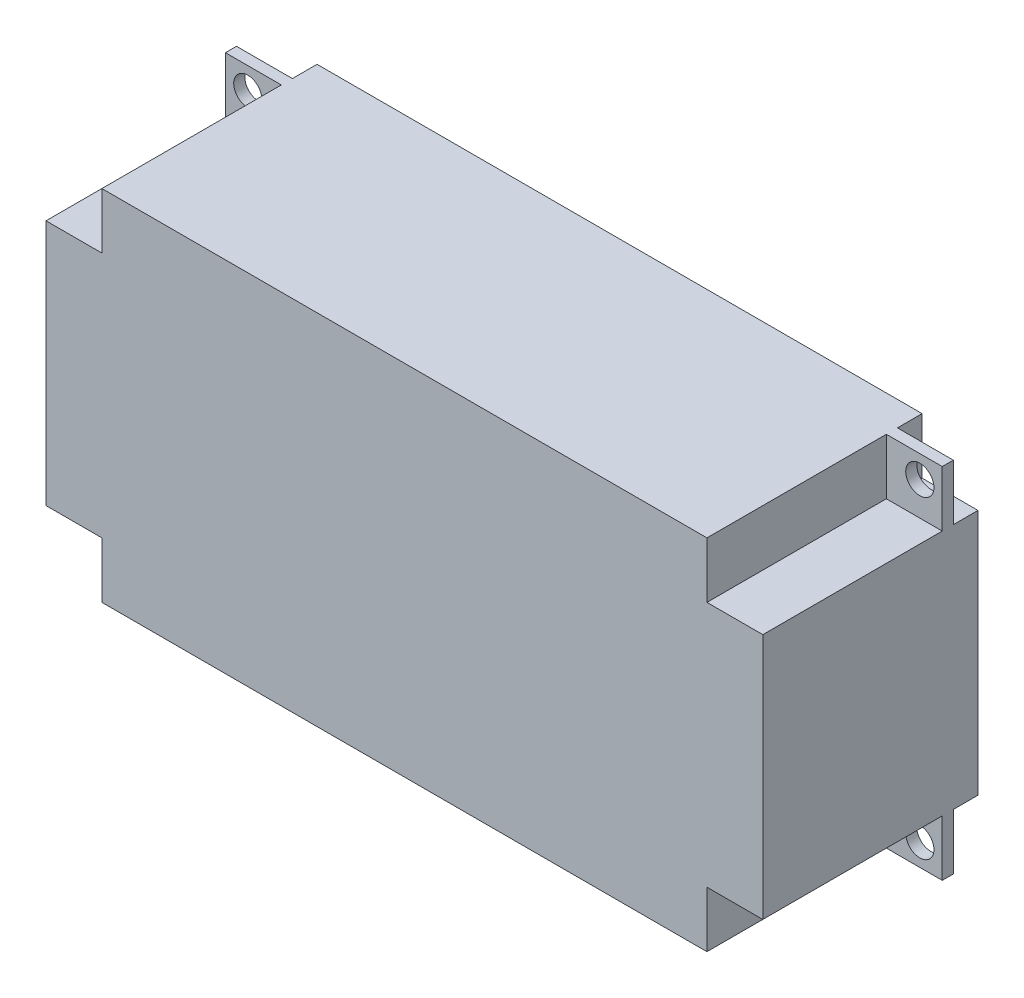
ISO-10303-21;
HEADER;
FILE_DESCRIPTION(('STEP AP214'),'2;1');
FILE_NAME('part.step','',(''),(''),'','','');
FILE_SCHEMA(('AUTOMOTIVE_DESIGN { 1 0 10303 214 1 1 1 1 }'));
ENDSEC;
DATA;
#1=APPLICATION_CONTEXT('core data for automotive mechanical design processes');
#2=APPLICATION_PROTOCOL_DEFINITION('international standard','automotive_design',2000,#1);
#3=PRODUCT_CONTEXT('',#1,'mechanical');
#4=PRODUCT('Part','Part','',(#3));
#5=PRODUCT_RELATED_PRODUCT_CATEGORY('part','',(#4));
#6=PRODUCT_DEFINITION_FORMATION('','',#4);
#7=PRODUCT_DEFINITION_CONTEXT('part definition',#1,'design');
#8=PRODUCT_DEFINITION('design','',#6,#7);
#9=PRODUCT_DEFINITION_SHAPE('','',#8);
#10=(LENGTH_UNIT() NAMED_UNIT(*) SI_UNIT(.MILLI.,.METRE.));
#11=(NAMED_UNIT(*) PLANE_ANGLE_UNIT() SI_UNIT($,.RADIAN.));
#12=(NAMED_UNIT(*) SI_UNIT($,.STERADIAN.) SOLID_ANGLE_UNIT());
#13=UNCERTAINTY_MEASURE_WITH_UNIT(LENGTH_MEASURE(1.E-05),#10,'distance_accuracy_value','');
#14=(GEOMETRIC_REPRESENTATION_CONTEXT(3) GLOBAL_UNCERTAINTY_ASSIGNED_CONTEXT((#13)) GLOBAL_UNIT_ASSIGNED_CONTEXT((#10,
#11,#12)) REPRESENTATION_CONTEXT('',''));
#15=CARTESIAN_POINT('',(0.,0.,0.));
#16=DIRECTION('',(0.,0.,1.));
#17=DIRECTION('',(1.,0.,0.));
#18=AXIS2_PLACEMENT_3D('',#15,#16,#17);
#19=CARTESIAN_POINT('',(0.,0.,1.57));
#20=DIRECTION('',(0.,0.,-1.));
#21=DIRECTION('',(-1.,0.,0.));
#22=AXIS2_PLACEMENT_3D('',#19,#20,#21);
#23=PLANE('',#22);
#24=CARTESIAN_POINT('',(-47.6249999999995,-22.225,1.57));
#25=DIRECTION('',(0.,0.,1.));
#26=DIRECTION('',(1.,0.,0.));
#27=AXIS2_PLACEMENT_3D('',#24,#25,#26);
#28=CIRCLE('',#27,2.);
#29=CARTESIAN_POINT('',(-45.6249999999995,-22.225,1.57));
#30=VERTEX_POINT('',#29);
#31=EDGE_CURVE('E358',#30,#30,#28,.T.);
#32=ORIENTED_EDGE('',*,*,#31,.F.);
#33=EDGE_LOOP('',(#32));
#34=FACE_BOUND('',#33,.T.);
#35=DIRECTION('',(1.,0.,0.));
#36=VECTOR('',#35,1.);
#37=CARTESIAN_POINT('',(0.,-17.48,1.57));
#38=LINE('',#37,#36);
#39=CARTESIAN_POINT('',(-50.8,-17.48,1.57));
#40=VERTEX_POINT('',#39);
#41=CARTESIAN_POINT('',(-42.88,-17.48,1.57));
#42=VERTEX_POINT('',#41);
#43=EDGE_CURVE('E356',#40,#42,#38,.T.);
#44=ORIENTED_EDGE('',*,*,#43,.F.);
#45=DIRECTION('',(0.,-1.,0.));
#46=VECTOR('',#45,1.);
#47=CARTESIAN_POINT('',(-50.8,-25.4,1.57));
#48=LINE('',#47,#46);
#49=CARTESIAN_POINT('',(-50.8,-25.4,1.57));
#50=VERTEX_POINT('',#49);
#51=EDGE_CURVE('E389',#40,#50,#48,.T.);
#52=ORIENTED_EDGE('',*,*,#51,.T.);
#53=DIRECTION('',(1.,0.,0.));
#54=VECTOR('',#53,1.);
#55=CARTESIAN_POINT('',(-50.8,-25.4,1.57));
#56=LINE('',#55,#54);
#57=CARTESIAN_POINT('',(-42.88,-25.4,1.57));
#58=VERTEX_POINT('',#57);
#59=EDGE_CURVE('E393',#50,#58,#56,.T.);
#60=ORIENTED_EDGE('',*,*,#59,.T.);
#61=DIRECTION('',(0.,-1.,0.));
#62=VECTOR('',#61,1.);
#63=CARTESIAN_POINT('',(-42.88,0.,1.57));
#64=LINE('',#63,#62);
#65=EDGE_CURVE('E48',#42,#58,#64,.T.);
#66=ORIENTED_EDGE('',*,*,#65,.F.);
#67=EDGE_LOOP('',(#44,#52,#60,#66));
#68=FACE_BOUND('',#67,.T.);
#69=ADVANCED_FACE('F33',(#34,#68),#23,.F.);
#70=CARTESIAN_POINT('',(47.6250000000005,-22.225,1.57));
#71=DIRECTION('',(0.,0.,1.));
#72=DIRECTION('',(1.,0.,0.));
#73=AXIS2_PLACEMENT_3D('',#70,#71,#72);
#74=CIRCLE('',#73,2.);
#75=CARTESIAN_POINT('',(49.6250000000005,-22.225,1.57));
#76=VERTEX_POINT('',#75);
#77=EDGE_CURVE('E369',#76,#76,#74,.T.);
#78=ORIENTED_EDGE('',*,*,#77,.F.);
#79=EDGE_LOOP('',(#78));
#80=FACE_BOUND('',#79,.T.);
#81=DIRECTION('',(0.,1.,0.));
#82=VECTOR('',#81,1.);
#83=CARTESIAN_POINT('',(42.88,0.,1.57));
#84=LINE('',#83,#82);
#85=CARTESIAN_POINT('',(42.88,-25.4,1.57));
#86=VERTEX_POINT('',#85);
#87=CARTESIAN_POINT('',(42.88,-17.48,1.57));
#88=VERTEX_POINT('',#87);
#89=EDGE_CURVE('E353',#86,#88,#84,.T.);
#90=ORIENTED_EDGE('',*,*,#89,.F.);
#91=CARTESIAN_POINT('',(50.8,-25.4,1.57));
#92=VERTEX_POINT('',#91);
#93=EDGE_CURVE('E392',#86,#92,#56,.T.);
#94=ORIENTED_EDGE('',*,*,#93,.T.);
#95=DIRECTION('',(0.,1.,0.));
#96=VECTOR('',#95,1.);
#97=CARTESIAN_POINT('',(50.8,-25.4,1.57));
#98=LINE('',#97,#96);
#99=CARTESIAN_POINT('',(50.8,-17.48,1.57));
#100=VERTEX_POINT('',#99);
#101=EDGE_CURVE('E383',#92,#100,#98,.T.);
#102=ORIENTED_EDGE('',*,*,#101,.T.);
#103=DIRECTION('',(1.,0.,0.));
#104=VECTOR('',#103,1.);
#105=CARTESIAN_POINT('',(0.,-17.48,1.57));
#106=LINE('',#105,#104);
#107=EDGE_CURVE('E56',#88,#100,#106,.T.);
#108=ORIENTED_EDGE('',*,*,#107,.F.);
#109=EDGE_LOOP('',(#90,#94,#102,#108));
#110=FACE_BOUND('',#109,.T.);
#111=ADVANCED_FACE('F517',(#80,#110),#23,.F.);
#112=CARTESIAN_POINT('',(47.625,22.225,1.57));
#113=DIRECTION('',(0.,0.,1.));
#114=DIRECTION('',(1.,0.,0.));
#115=AXIS2_PLACEMENT_3D('',#112,#113,#114);
#116=CIRCLE('',#115,2.);
#117=CARTESIAN_POINT('',(49.625,22.225,1.57));
#118=VERTEX_POINT('',#117);
#119=EDGE_CURVE('E363',#118,#118,#116,.T.);
#120=ORIENTED_EDGE('',*,*,#119,.F.);
#121=EDGE_LOOP('',(#120));
#122=FACE_BOUND('',#121,.T.);
#123=DIRECTION('',(-1.,0.,0.));
#124=VECTOR('',#123,1.);
#125=CARTESIAN_POINT('',(0.,17.48,1.57));
#126=LINE('',#125,#124);
#127=CARTESIAN_POINT('',(50.8,17.48,1.57));
#128=VERTEX_POINT('',#127);
#129=CARTESIAN_POINT('',(42.88,17.48,1.57));
#130=VERTEX_POINT('',#129);
#131=EDGE_CURVE('E349',#128,#130,#126,.T.);
#132=ORIENTED_EDGE('',*,*,#131,.F.);
#133=CARTESIAN_POINT('',(50.8,25.4,1.57));
#134=VERTEX_POINT('',#133);
#135=EDGE_CURVE('E386',#128,#134,#98,.T.);
#136=ORIENTED_EDGE('',*,*,#135,.T.);
#137=DIRECTION('',(-1.,0.,0.));
#138=VECTOR('',#137,1.);
#139=CARTESIAN_POINT('',(-50.8,25.4,1.57));
#140=LINE('',#139,#138);
#141=CARTESIAN_POINT('',(42.88,25.4,1.57));
#142=VERTEX_POINT('',#141);
#143=EDGE_CURVE('E387',#134,#142,#140,.T.);
#144=ORIENTED_EDGE('',*,*,#143,.T.);
#145=DIRECTION('',(0.,1.,0.));
#146=VECTOR('',#145,1.);
#147=CARTESIAN_POINT('',(42.88,0.,1.57));
#148=LINE('',#147,#146);
#149=EDGE_CURVE('E346',#130,#142,#148,.T.);
#150=ORIENTED_EDGE('',*,*,#149,.F.);
#151=EDGE_LOOP('',(#132,#136,#144,#150));
#152=FACE_BOUND('',#151,.T.);
#153=ADVANCED_FACE('F546',(#122,#152),#23,.F.);
#154=CARTESIAN_POINT('',(-47.625,22.225,1.57));
#155=DIRECTION('',(0.,0.,1.));
#156=DIRECTION('',(1.,0.,0.));
#157=AXIS2_PLACEMENT_3D('',#154,#155,#156);
#158=CIRCLE('',#157,2.);
#159=CARTESIAN_POINT('',(-45.625,22.225,1.57));
#160=VERTEX_POINT('',#159);
#161=EDGE_CURVE('E362',#160,#160,#158,.T.);
#162=ORIENTED_EDGE('',*,*,#161,.F.);
#163=EDGE_LOOP('',(#162));
#164=FACE_BOUND('',#163,.T.);
#165=DIRECTION('',(0.,-1.,0.));
#166=VECTOR('',#165,1.);
#167=CARTESIAN_POINT('',(-42.88,0.,1.57));
#168=LINE('',#167,#166);
#169=CARTESIAN_POINT('',(-42.88,25.4,1.57));
#170=VERTEX_POINT('',#169);
#171=CARTESIAN_POINT('',(-42.88,17.48,1.57));
#172=VERTEX_POINT('',#171);
#173=EDGE_CURVE('E343',#170,#172,#168,.T.);
#174=ORIENTED_EDGE('',*,*,#173,.F.);
#175=CARTESIAN_POINT('',(-50.8,25.4,1.57));
#176=VERTEX_POINT('',#175);
#177=EDGE_CURVE('E385',#170,#176,#140,.T.);
#178=ORIENTED_EDGE('',*,*,#177,.T.);
#179=CARTESIAN_POINT('',(-50.8,17.48,1.57));
#180=VERTEX_POINT('',#179);
#181=EDGE_CURVE('E390',#176,#180,#48,.T.);
#182=ORIENTED_EDGE('',*,*,#181,.T.);
#183=DIRECTION('',(-1.,0.,0.));
#184=VECTOR('',#183,1.);
#185=CARTESIAN_POINT('',(0.,17.48,1.57));
#186=LINE('',#185,#184);
#187=EDGE_CURVE('E340',#172,#180,#186,.T.);
#188=ORIENTED_EDGE('',*,*,#187,.F.);
#189=EDGE_LOOP('',(#174,#178,#182,#188));
#190=FACE_BOUND('',#189,.T.);
#191=ADVANCED_FACE('F464',(#164,#190),#23,.F.);
#192=CARTESIAN_POINT('',(0.,0.,0.));
#193=DIRECTION('',(0.,0.,-1.));
#194=DIRECTION('',(-1.,0.,0.));
#195=AXIS2_PLACEMENT_3D('',#192,#193,#194);
#196=PLANE('',#195);
#197=CARTESIAN_POINT('',(-47.6249999999995,-22.225,0.));
#198=DIRECTION('',(0.,0.,1.));
#199=DIRECTION('',(1.,0.,0.));
#200=AXIS2_PLACEMENT_3D('',#197,#198,#199);
#201=CIRCLE('',#200,2.);
#202=CARTESIAN_POINT('',(-45.6249999999995,-22.225,0.));
#203=VERTEX_POINT('',#202);
#204=EDGE_CURVE('E372',#203,#203,#201,.T.);
#205=ORIENTED_EDGE('',*,*,#204,.T.);
#206=EDGE_LOOP('',(#205));
#207=FACE_BOUND('',#206,.T.);
#208=DIRECTION('',(0.,-1.,0.));
#209=VECTOR('',#208,1.);
#210=CARTESIAN_POINT('',(-50.8,-25.4,0.));
#211=LINE('',#210,#209);
#212=CARTESIAN_POINT('',(-50.8,-17.48,0.));
#213=VERTEX_POINT('',#212);
#214=CARTESIAN_POINT('',(-50.8,-25.4,0.));
#215=VERTEX_POINT('',#214);
#216=EDGE_CURVE('E403',#213,#215,#211,.T.);
#217=ORIENTED_EDGE('',*,*,#216,.F.);
#218=DIRECTION('',(1.,0.,0.));
#219=VECTOR('',#218,1.);
#220=CARTESIAN_POINT('',(0.,-17.48,0.));
#221=LINE('',#220,#219);
#222=CARTESIAN_POINT('',(-42.88,-17.48,0.));
#223=VERTEX_POINT('',#222);
#224=EDGE_CURVE('E11',#213,#223,#221,.T.);
#225=ORIENTED_EDGE('',*,*,#224,.T.);
#226=DIRECTION('',(0.,-1.,0.));
#227=VECTOR('',#226,1.);
#228=CARTESIAN_POINT('',(-42.88,0.,0.));
#229=LINE('',#228,#227);
#230=CARTESIAN_POINT('',(-42.88,-25.4,0.));
#231=VERTEX_POINT('',#230);
#232=EDGE_CURVE('E41',#223,#231,#229,.T.);
#233=ORIENTED_EDGE('',*,*,#232,.T.);
#234=DIRECTION('',(1.,0.,0.));
#235=VECTOR('',#234,1.);
#236=CARTESIAN_POINT('',(-50.8,-25.4,0.));
#237=LINE('',#236,#235);
#238=EDGE_CURVE('E407',#215,#231,#237,.T.);
#239=ORIENTED_EDGE('',*,*,#238,.F.);
#240=EDGE_LOOP('',(#217,#225,#233,#239));
#241=FACE_BOUND('',#240,.T.);
#242=ADVANCED_FACE('F441',(#207,#241),#196,.T.);
#243=CARTESIAN_POINT('',(47.6250000000005,-22.225,0.));
#244=DIRECTION('',(0.,0.,1.));
#245=DIRECTION('',(1.,0.,0.));
#246=AXIS2_PLACEMENT_3D('',#243,#244,#245);
#247=CIRCLE('',#246,2.);
#248=CARTESIAN_POINT('',(49.6250000000005,-22.225,0.));
#249=VERTEX_POINT('',#248);
#250=EDGE_CURVE('E366',#249,#249,#247,.T.);
#251=ORIENTED_EDGE('',*,*,#250,.T.);
#252=EDGE_LOOP('',(#251));
#253=FACE_BOUND('',#252,.T.);
#254=CARTESIAN_POINT('',(42.88,-25.4,0.));
#255=VERTEX_POINT('',#254);
#256=CARTESIAN_POINT('',(50.8,-25.4,0.));
#257=VERTEX_POINT('',#256);
#258=EDGE_CURVE('E406',#255,#257,#237,.T.);
#259=ORIENTED_EDGE('',*,*,#258,.F.);
#260=DIRECTION('',(0.,1.,0.));
#261=VECTOR('',#260,1.);
#262=CARTESIAN_POINT('',(42.88,0.,0.));
#263=LINE('',#262,#261);
#264=CARTESIAN_POINT('',(42.88,-17.48,0.));
#265=VERTEX_POINT('',#264);
#266=EDGE_CURVE('E436',#255,#265,#263,.T.);
#267=ORIENTED_EDGE('',*,*,#266,.T.);
#268=DIRECTION('',(1.,0.,0.));
#269=VECTOR('',#268,1.);
#270=CARTESIAN_POINT('',(0.,-17.48,0.));
#271=LINE('',#270,#269);
#272=CARTESIAN_POINT('',(50.8,-17.48,0.));
#273=VERTEX_POINT('',#272);
#274=EDGE_CURVE('E433',#265,#273,#271,.T.);
#275=ORIENTED_EDGE('',*,*,#274,.T.);
#276=DIRECTION('',(0.,1.,0.));
#277=VECTOR('',#276,1.);
#278=CARTESIAN_POINT('',(50.8,-25.4,0.));
#279=LINE('',#278,#277);
#280=EDGE_CURVE('E396',#257,#273,#279,.T.);
#281=ORIENTED_EDGE('',*,*,#280,.F.);
#282=EDGE_LOOP('',(#259,#267,#275,#281));
#283=FACE_BOUND('',#282,.T.);
#284=ADVANCED_FACE('F510',(#253,#283),#196,.T.);
#285=CARTESIAN_POINT('',(47.625,22.225,0.));
#286=DIRECTION('',(0.,0.,1.));
#287=DIRECTION('',(1.,0.,0.));
#288=AXIS2_PLACEMENT_3D('',#285,#286,#287);
#289=CIRCLE('',#288,2.);
#290=CARTESIAN_POINT('',(49.625,22.225,0.));
#291=VERTEX_POINT('',#290);
#292=EDGE_CURVE('E359',#291,#291,#289,.T.);
#293=ORIENTED_EDGE('',*,*,#292,.T.);
#294=EDGE_LOOP('',(#293));
#295=FACE_BOUND('',#294,.T.);
#296=CARTESIAN_POINT('',(50.8,17.48,0.));
#297=VERTEX_POINT('',#296);
#298=CARTESIAN_POINT('',(50.8,25.4,0.));
#299=VERTEX_POINT('',#298);
#300=EDGE_CURVE('E380',#297,#299,#279,.T.);
#301=ORIENTED_EDGE('',*,*,#300,.F.);
#302=DIRECTION('',(-1.,0.,0.));
#303=VECTOR('',#302,1.);
#304=CARTESIAN_POINT('',(0.,17.48,0.));
#305=LINE('',#304,#303);
#306=CARTESIAN_POINT('',(42.88,17.48,0.));
#307=VERTEX_POINT('',#306);
#308=EDGE_CURVE('E430',#297,#307,#305,.T.);
#309=ORIENTED_EDGE('',*,*,#308,.T.);
#310=DIRECTION('',(0.,1.,0.));
#311=VECTOR('',#310,1.);
#312=CARTESIAN_POINT('',(42.88,0.,0.));
#313=LINE('',#312,#311);
#314=CARTESIAN_POINT('',(42.88,25.4,0.));
#315=VERTEX_POINT('',#314);
#316=EDGE_CURVE('E427',#307,#315,#313,.T.);
#317=ORIENTED_EDGE('',*,*,#316,.T.);
#318=DIRECTION('',(-1.,0.,0.));
#319=VECTOR('',#318,1.);
#320=CARTESIAN_POINT('',(-50.8,25.4,0.));
#321=LINE('',#320,#319);
#322=EDGE_CURVE('E400',#299,#315,#321,.T.);
#323=ORIENTED_EDGE('',*,*,#322,.F.);
#324=EDGE_LOOP('',(#301,#309,#317,#323));
#325=FACE_BOUND('',#324,.T.);
#326=ADVANCED_FACE('F493',(#295,#325),#196,.T.);
#327=CARTESIAN_POINT('',(-47.625,22.225,0.));
#328=DIRECTION('',(0.,0.,1.));
#329=DIRECTION('',(1.,0.,0.));
#330=AXIS2_PLACEMENT_3D('',#327,#328,#329);
#331=CIRCLE('',#330,2.);
#332=CARTESIAN_POINT('',(-45.625,22.225,0.));
#333=VERTEX_POINT('',#332);
#334=EDGE_CURVE('E377',#333,#333,#331,.T.);
#335=ORIENTED_EDGE('',*,*,#334,.T.);
#336=EDGE_LOOP('',(#335));
#337=FACE_BOUND('',#336,.T.);
#338=CARTESIAN_POINT('',(-42.88,25.4,0.));
#339=VERTEX_POINT('',#338);
#340=CARTESIAN_POINT('',(-50.8,25.4,0.));
#341=VERTEX_POINT('',#340);
#342=EDGE_CURVE('E399',#339,#341,#321,.T.);
#343=ORIENTED_EDGE('',*,*,#342,.F.);
#344=DIRECTION('',(0.,-1.,0.));
#345=VECTOR('',#344,1.);
#346=CARTESIAN_POINT('',(-42.88,0.,0.));
#347=LINE('',#346,#345);
#348=CARTESIAN_POINT('',(-42.88,17.48,0.));
#349=VERTEX_POINT('',#348);
#350=EDGE_CURVE('E424',#339,#349,#347,.T.);
#351=ORIENTED_EDGE('',*,*,#350,.T.);
#352=DIRECTION('',(-1.,0.,0.));
#353=VECTOR('',#352,1.);
#354=CARTESIAN_POINT('',(0.,17.48,0.));
#355=LINE('',#354,#353);
#356=CARTESIAN_POINT('',(-50.8,17.48,0.));
#357=VERTEX_POINT('',#356);
#358=EDGE_CURVE('E421',#349,#357,#355,.T.);
#359=ORIENTED_EDGE('',*,*,#358,.T.);
#360=EDGE_CURVE('E404',#341,#357,#211,.T.);
#361=ORIENTED_EDGE('',*,*,#360,.F.);
#362=EDGE_LOOP('',(#343,#351,#359,#361));
#363=FACE_BOUND('',#362,.T.);
#364=ADVANCED_FACE('F478',(#337,#363),#196,.T.);
#365=CARTESIAN_POINT('',(50.8,-25.4,1.57));
#366=DIRECTION('',(-1.,0.,0.));
#367=DIRECTION('',(0.,0.,1.));
#368=AXIS2_PLACEMENT_3D('',#365,#366,#367);
#369=PLANE('',#368);
#370=DIRECTION('',(0.,0.,-1.));
#371=VECTOR('',#370,1.);
#372=CARTESIAN_POINT('',(50.8,17.48,27.));
#373=LINE('',#372,#371);
#374=CARTESIAN_POINT('',(50.8,17.48,-3.5));
#375=VERTEX_POINT('',#374);
#376=EDGE_CURVE('E316',#297,#375,#373,.T.);
#377=ORIENTED_EDGE('',*,*,#376,.F.);
#378=ORIENTED_EDGE('',*,*,#300,.T.);
#379=DIRECTION('',(0.,0.,-1.));
#380=VECTOR('',#379,1.);
#381=CARTESIAN_POINT('',(50.8,25.4,1.57));
#382=LINE('',#381,#380);
#383=EDGE_CURVE('E418',#134,#299,#382,.T.);
#384=ORIENTED_EDGE('',*,*,#383,.F.);
#385=ORIENTED_EDGE('',*,*,#135,.F.);
#386=CARTESIAN_POINT('',(50.8,17.48,27.));
#387=VERTEX_POINT('',#386);
#388=EDGE_CURVE('E317',#387,#128,#373,.T.);
#389=ORIENTED_EDGE('',*,*,#388,.F.);
#390=DIRECTION('',(0.,1.,0.));
#391=VECTOR('',#390,1.);
#392=CARTESIAN_POINT('',(50.8,17.48,27.));
#393=LINE('',#392,#391);
#394=CARTESIAN_POINT('',(50.8,-17.48,27.));
#395=VERTEX_POINT('',#394);
#396=EDGE_CURVE('E286',#395,#387,#393,.T.);
#397=ORIENTED_EDGE('',*,*,#396,.F.);
#398=DIRECTION('',(0.,0.,-1.));
#399=VECTOR('',#398,1.);
#400=CARTESIAN_POINT('',(50.8,-17.48,27.));
#401=LINE('',#400,#399);
#402=EDGE_CURVE('E321',#395,#100,#401,.T.);
#403=ORIENTED_EDGE('',*,*,#402,.T.);
#404=ORIENTED_EDGE('',*,*,#101,.F.);
#405=DIRECTION('',(0.,0.,-1.));
#406=VECTOR('',#405,1.);
#407=CARTESIAN_POINT('',(50.8,-25.4,1.57));
#408=LINE('',#407,#406);
#409=EDGE_CURVE('E395',#92,#257,#408,.T.);
#410=ORIENTED_EDGE('',*,*,#409,.T.);
#411=ORIENTED_EDGE('',*,*,#280,.T.);
#412=CARTESIAN_POINT('',(50.8,-17.48,-3.5));
#413=VERTEX_POINT('',#412);
#414=EDGE_CURVE('E320',#273,#413,#401,.T.);
#415=ORIENTED_EDGE('',*,*,#414,.T.);
#416=DIRECTION('',(0.,1.,0.));
#417=VECTOR('',#416,1.);
#418=CARTESIAN_POINT('',(50.8,17.48,-3.5));
#419=LINE('',#418,#417);
#420=EDGE_CURVE('E256',#413,#375,#419,.T.);
#421=ORIENTED_EDGE('',*,*,#420,.T.);
#422=EDGE_LOOP('',(#377,#378,#384,#385,#389,#397,#403,#404,#410,#411,#415,#421));
#423=FACE_BOUND('',#422,.T.);
#424=ADVANCED_FACE('F35',(#423),#369,.F.);
#425=CARTESIAN_POINT('',(-50.8,25.4,1.57));
#426=DIRECTION('',(0.,-1.,0.));
#427=DIRECTION('',(0.,0.,-1.));
#428=AXIS2_PLACEMENT_3D('',#425,#426,#427);
#429=PLANE('',#428);
#430=DIRECTION('',(0.,0.,-1.));
#431=VECTOR('',#430,1.);
#432=CARTESIAN_POINT('',(-42.88,25.4,27.));
#433=LINE('',#432,#431);
#434=CARTESIAN_POINT('',(-42.88,25.4,-3.5));
#435=VERTEX_POINT('',#434);
#436=EDGE_CURVE('E304',#339,#435,#433,.T.);
#437=ORIENTED_EDGE('',*,*,#436,.F.);
#438=ORIENTED_EDGE('',*,*,#342,.T.);
#439=DIRECTION('',(0.,0.,-1.));
#440=VECTOR('',#439,1.);
#441=CARTESIAN_POINT('',(-50.8,25.4,1.57));
#442=LINE('',#441,#440);
#443=EDGE_CURVE('E415',#176,#341,#442,.T.);
#444=ORIENTED_EDGE('',*,*,#443,.F.);
#445=ORIENTED_EDGE('',*,*,#177,.F.);
#446=CARTESIAN_POINT('',(-42.88,25.4,27.));
#447=VERTEX_POINT('',#446);
#448=EDGE_CURVE('E305',#447,#170,#433,.T.);
#449=ORIENTED_EDGE('',*,*,#448,.F.);
#450=DIRECTION('',(-1.,0.,0.));
#451=VECTOR('',#450,1.);
#452=CARTESIAN_POINT('',(-42.88,25.4,27.));
#453=LINE('',#452,#451);
#454=CARTESIAN_POINT('',(42.88,25.4,27.));
#455=VERTEX_POINT('',#454);
#456=EDGE_CURVE('E292',#455,#447,#453,.T.);
#457=ORIENTED_EDGE('',*,*,#456,.F.);
#458=DIRECTION('',(0.,0.,-1.));
#459=VECTOR('',#458,1.);
#460=CARTESIAN_POINT('',(42.88,25.4,27.));
#461=LINE('',#460,#459);
#462=EDGE_CURVE('E309',#455,#142,#461,.T.);
#463=ORIENTED_EDGE('',*,*,#462,.T.);
#464=ORIENTED_EDGE('',*,*,#143,.F.);
#465=ORIENTED_EDGE('',*,*,#383,.T.);
#466=ORIENTED_EDGE('',*,*,#322,.T.);
#467=CARTESIAN_POINT('',(42.88,25.4,-3.5));
#468=VERTEX_POINT('',#467);
#469=EDGE_CURVE('E308',#315,#468,#461,.T.);
#470=ORIENTED_EDGE('',*,*,#469,.T.);
#471=DIRECTION('',(-1.,0.,0.));
#472=VECTOR('',#471,1.);
#473=CARTESIAN_POINT('',(-42.88,25.4,-3.5));
#474=LINE('',#473,#472);
#475=EDGE_CURVE('E265',#468,#435,#474,.T.);
#476=ORIENTED_EDGE('',*,*,#475,.T.);
#477=EDGE_LOOP('',(#437,#438,#444,#445,#449,#457,#463,#464,#465,#466,#470,#476));
#478=FACE_BOUND('',#477,.T.);
#479=ADVANCED_FACE('F473',(#478),#429,.F.);
#480=CARTESIAN_POINT('',(-50.8,-25.4,1.57));
#481=DIRECTION('',(1.,0.,0.));
#482=DIRECTION('',(0.,0.,-1.));
#483=AXIS2_PLACEMENT_3D('',#480,#481,#482);
#484=PLANE('',#483);
#485=DIRECTION('',(0.,0.,-1.));
#486=VECTOR('',#485,1.);
#487=CARTESIAN_POINT('',(-50.8,17.48,27.));
#488=LINE('',#487,#486);
#489=CARTESIAN_POINT('',(-50.8,17.48,27.));
#490=VERTEX_POINT('',#489);
#491=EDGE_CURVE('E298',#490,#180,#488,.T.);
#492=ORIENTED_EDGE('',*,*,#491,.T.);
#493=ORIENTED_EDGE('',*,*,#181,.F.);
#494=ORIENTED_EDGE('',*,*,#443,.T.);
#495=ORIENTED_EDGE('',*,*,#360,.T.);
#496=CARTESIAN_POINT('',(-50.8,17.48,-3.5));
#497=VERTEX_POINT('',#496);
#498=EDGE_CURVE('E243',#357,#497,#488,.T.);
#499=ORIENTED_EDGE('',*,*,#498,.T.);
#500=DIRECTION('',(0.,-1.,0.));
#501=VECTOR('',#500,1.);
#502=CARTESIAN_POINT('',(-50.8,-17.48,-3.5));
#503=LINE('',#502,#501);
#504=CARTESIAN_POINT('',(-50.8,-17.48,-3.5));
#505=VERTEX_POINT('',#504);
#506=EDGE_CURVE('E234',#497,#505,#503,.T.);
#507=ORIENTED_EDGE('',*,*,#506,.T.);
#508=DIRECTION('',(0.,0.,-1.));
#509=VECTOR('',#508,1.);
#510=CARTESIAN_POINT('',(-50.8,-17.48,27.));
#511=LINE('',#510,#509);
#512=EDGE_CURVE('E218',#213,#505,#511,.T.);
#513=ORIENTED_EDGE('',*,*,#512,.F.);
#514=ORIENTED_EDGE('',*,*,#216,.T.);
#515=DIRECTION('',(0.,0.,-1.));
#516=VECTOR('',#515,1.);
#517=CARTESIAN_POINT('',(-50.8,-25.4,1.57));
#518=LINE('',#517,#516);
#519=EDGE_CURVE('E412',#50,#215,#518,.T.);
#520=ORIENTED_EDGE('',*,*,#519,.F.);
#521=ORIENTED_EDGE('',*,*,#51,.F.);
#522=CARTESIAN_POINT('',(-50.8,-17.48,27.));
#523=VERTEX_POINT('',#522);
#524=EDGE_CURVE('E226',#523,#40,#511,.T.);
#525=ORIENTED_EDGE('',*,*,#524,.F.);
#526=DIRECTION('',(0.,-1.,0.));
#527=VECTOR('',#526,1.);
#528=CARTESIAN_POINT('',(-50.8,-17.48,27.));
#529=LINE('',#528,#527);
#530=EDGE_CURVE('E273',#490,#523,#529,.T.);
#531=ORIENTED_EDGE('',*,*,#530,.F.);
#532=EDGE_LOOP('',(#492,#493,#494,#495,#499,#507,#513,#514,#520,#521,#525,#531));
#533=FACE_BOUND('',#532,.T.);
#534=ADVANCED_FACE('F241',(#533),#484,.F.);
#535=CARTESIAN_POINT('',(-50.8,-25.4,1.57));
#536=DIRECTION('',(0.,1.,0.));
#537=DIRECTION('',(0.,0.,1.));
#538=AXIS2_PLACEMENT_3D('',#535,#536,#537);
#539=PLANE('',#538);
#540=DIRECTION('',(0.,0.,-1.));
#541=VECTOR('',#540,1.);
#542=CARTESIAN_POINT('',(42.88,-25.4,27.));
#543=LINE('',#542,#541);
#544=CARTESIAN_POINT('',(42.88,-25.4,-3.5));
#545=VERTEX_POINT('',#544);
#546=EDGE_CURVE('E328',#255,#545,#543,.T.);
#547=ORIENTED_EDGE('',*,*,#546,.F.);
#548=ORIENTED_EDGE('',*,*,#258,.T.);
#549=ORIENTED_EDGE('',*,*,#409,.F.);
#550=ORIENTED_EDGE('',*,*,#93,.F.);
#551=CARTESIAN_POINT('',(42.88,-25.4,27.));
#552=VERTEX_POINT('',#551);
#553=EDGE_CURVE('E329',#552,#86,#543,.T.);
#554=ORIENTED_EDGE('',*,*,#553,.F.);
#555=DIRECTION('',(1.,0.,0.));
#556=VECTOR('',#555,1.);
#557=CARTESIAN_POINT('',(42.88,-25.4,27.));
#558=LINE('',#557,#556);
#559=CARTESIAN_POINT('',(-42.88,-25.4,27.));
#560=VERTEX_POINT('',#559);
#561=EDGE_CURVE('E280',#560,#552,#558,.T.);
#562=ORIENTED_EDGE('',*,*,#561,.F.);
#563=DIRECTION('',(0.,0.,-1.));
#564=VECTOR('',#563,1.);
#565=CARTESIAN_POINT('',(-42.88,-25.4,27.));
#566=LINE('',#565,#564);
#567=EDGE_CURVE('E333',#560,#58,#566,.T.);
#568=ORIENTED_EDGE('',*,*,#567,.T.);
#569=ORIENTED_EDGE('',*,*,#59,.F.);
#570=ORIENTED_EDGE('',*,*,#519,.T.);
#571=ORIENTED_EDGE('',*,*,#238,.T.);
#572=CARTESIAN_POINT('',(-42.88,-25.4,-3.5));
#573=VERTEX_POINT('',#572);
#574=EDGE_CURVE('E332',#231,#573,#566,.T.);
#575=ORIENTED_EDGE('',*,*,#574,.T.);
#576=DIRECTION('',(1.,0.,0.));
#577=VECTOR('',#576,1.);
#578=CARTESIAN_POINT('',(42.88,-25.4,-3.5));
#579=LINE('',#578,#577);
#580=EDGE_CURVE('E247',#573,#545,#579,.T.);
#581=ORIENTED_EDGE('',*,*,#580,.T.);
#582=EDGE_LOOP('',(#547,#548,#549,#550,#554,#562,#568,#569,#570,#571,#575,#581));
#583=FACE_BOUND('',#582,.T.);
#584=ADVANCED_FACE('F445',(#583),#539,.F.);
#585=CARTESIAN_POINT('',(-47.625,22.225,0.));
#586=DIRECTION('',(0.,0.,1.));
#587=DIRECTION('',(1.,0.,0.));
#588=AXIS2_PLACEMENT_3D('',#585,#586,#587);
#589=CYLINDRICAL_SURFACE('',#588,2.);
#590=ORIENTED_EDGE('',*,*,#334,.F.);
#591=EDGE_LOOP('',(#590));
#592=FACE_BOUND('',#591,.T.);
#593=ORIENTED_EDGE('',*,*,#161,.T.);
#594=EDGE_LOOP('',(#593));
#595=FACE_BOUND('',#594,.T.);
#596=ADVANCED_FACE('F561',(#592,#595),#589,.F.);
#597=CARTESIAN_POINT('',(47.625,22.225,0.));
#598=DIRECTION('',(0.,0.,1.));
#599=DIRECTION('',(1.,0.,0.));
#600=AXIS2_PLACEMENT_3D('',#597,#598,#599);
#601=CYLINDRICAL_SURFACE('',#600,2.);
#602=ORIENTED_EDGE('',*,*,#292,.F.);
#603=EDGE_LOOP('',(#602));
#604=FACE_BOUND('',#603,.T.);
#605=ORIENTED_EDGE('',*,*,#119,.T.);
#606=EDGE_LOOP('',(#605));
#607=FACE_BOUND('',#606,.T.);
#608=ADVANCED_FACE('F563',(#604,#607),#601,.F.);
#609=CARTESIAN_POINT('',(47.6250000000005,-22.225,0.));
#610=DIRECTION('',(0.,0.,1.));
#611=DIRECTION('',(1.,0.,0.));
#612=AXIS2_PLACEMENT_3D('',#609,#610,#611);
#613=CYLINDRICAL_SURFACE('',#612,2.);
#614=ORIENTED_EDGE('',*,*,#250,.F.);
#615=EDGE_LOOP('',(#614));
#616=FACE_BOUND('',#615,.T.);
#617=ORIENTED_EDGE('',*,*,#77,.T.);
#618=EDGE_LOOP('',(#617));
#619=FACE_BOUND('',#618,.T.);
#620=ADVANCED_FACE('F569',(#616,#619),#613,.F.);
#621=CARTESIAN_POINT('',(-47.6249999999995,-22.225,0.));
#622=DIRECTION('',(0.,0.,1.));
#623=DIRECTION('',(1.,0.,0.));
#624=AXIS2_PLACEMENT_3D('',#621,#622,#623);
#625=CYLINDRICAL_SURFACE('',#624,2.);
#626=ORIENTED_EDGE('',*,*,#204,.F.);
#627=EDGE_LOOP('',(#626));
#628=FACE_BOUND('',#627,.T.);
#629=ORIENTED_EDGE('',*,*,#31,.T.);
#630=EDGE_LOOP('',(#629));
#631=FACE_BOUND('',#630,.T.);
#632=ADVANCED_FACE('F575',(#628,#631),#625,.F.);
#633=CARTESIAN_POINT('',(0.,0.,-3.5));
#634=DIRECTION('',(0.,0.,-1.));
#635=DIRECTION('',(-1.,0.,0.));
#636=AXIS2_PLACEMENT_3D('',#633,#634,#635);
#637=PLANE('',#636);
#638=ORIENTED_EDGE('',*,*,#506,.F.);
#639=DIRECTION('',(-1.,0.,0.));
#640=VECTOR('',#639,1.);
#641=CARTESIAN_POINT('',(-50.8,17.48,-3.5));
#642=LINE('',#641,#640);
#643=CARTESIAN_POINT('',(-42.88,17.48,-3.5));
#644=VERTEX_POINT('',#643);
#645=EDGE_CURVE('E271',#644,#497,#642,.T.);
#646=ORIENTED_EDGE('',*,*,#645,.F.);
#647=DIRECTION('',(0.,-1.,0.));
#648=VECTOR('',#647,1.);
#649=CARTESIAN_POINT('',(-42.88,17.48,-3.5));
#650=LINE('',#649,#648);
#651=EDGE_CURVE('E268',#435,#644,#650,.T.);
#652=ORIENTED_EDGE('',*,*,#651,.F.);
#653=ORIENTED_EDGE('',*,*,#475,.F.);
#654=DIRECTION('',(0.,1.,0.));
#655=VECTOR('',#654,1.);
#656=CARTESIAN_POINT('',(42.88,25.4,-3.5));
#657=LINE('',#656,#655);
#658=CARTESIAN_POINT('',(42.88,17.48,-3.5));
#659=VERTEX_POINT('',#658);
#660=EDGE_CURVE('E262',#659,#468,#657,.T.);
#661=ORIENTED_EDGE('',*,*,#660,.F.);
#662=DIRECTION('',(-1.,0.,0.));
#663=VECTOR('',#662,1.);
#664=CARTESIAN_POINT('',(42.88,17.48,-3.5));
#665=LINE('',#664,#663);
#666=EDGE_CURVE('E259',#375,#659,#665,.T.);
#667=ORIENTED_EDGE('',*,*,#666,.F.);
#668=ORIENTED_EDGE('',*,*,#420,.F.);
#669=DIRECTION('',(1.,0.,0.));
#670=VECTOR('',#669,1.);
#671=CARTESIAN_POINT('',(50.8,-17.48,-3.5));
#672=LINE('',#671,#670);
#673=CARTESIAN_POINT('',(42.88,-17.48,-3.5));
#674=VERTEX_POINT('',#673);
#675=EDGE_CURVE('E253',#674,#413,#672,.T.);
#676=ORIENTED_EDGE('',*,*,#675,.F.);
#677=DIRECTION('',(0.,1.,0.));
#678=VECTOR('',#677,1.);
#679=CARTESIAN_POINT('',(42.88,-17.48,-3.5));
#680=LINE('',#679,#678);
#681=EDGE_CURVE('E250',#545,#674,#680,.T.);
#682=ORIENTED_EDGE('',*,*,#681,.F.);
#683=ORIENTED_EDGE('',*,*,#580,.F.);
#684=DIRECTION('',(0.,-1.,0.));
#685=VECTOR('',#684,1.);
#686=CARTESIAN_POINT('',(-42.88,-25.4,-3.5));
#687=LINE('',#686,#685);
#688=CARTESIAN_POINT('',(-42.88,-17.48,-3.5));
#689=VERTEX_POINT('',#688);
#690=EDGE_CURVE('E238',#689,#573,#687,.T.);
#691=ORIENTED_EDGE('',*,*,#690,.F.);
#692=DIRECTION('',(1.,0.,0.));
#693=VECTOR('',#692,1.);
#694=CARTESIAN_POINT('',(-42.88,-17.48,-3.5));
#695=LINE('',#694,#693);
#696=EDGE_CURVE('E222',#505,#689,#695,.T.);
#697=ORIENTED_EDGE('',*,*,#696,.F.);
#698=EDGE_LOOP('',(#638,#646,#652,#653,#661,#667,#668,#676,#682,#683,#691,#697));
#699=FACE_BOUND('',#698,.T.);
#700=ADVANCED_FACE('F232',(#699),#637,.T.);
#701=CARTESIAN_POINT('',(-50.8,17.48,27.));
#702=DIRECTION('',(0.,-1.,0.));
#703=DIRECTION('',(0.,0.,-1.));
#704=AXIS2_PLACEMENT_3D('',#701,#702,#703);
#705=PLANE('',#704);
#706=ORIENTED_EDGE('',*,*,#358,.F.);
#707=DIRECTION('',(0.,0.,-1.));
#708=VECTOR('',#707,1.);
#709=CARTESIAN_POINT('',(-42.88,17.48,27.));
#710=LINE('',#709,#708);
#711=EDGE_CURVE('E300',#349,#644,#710,.T.);
#712=ORIENTED_EDGE('',*,*,#711,.T.);
#713=ORIENTED_EDGE('',*,*,#645,.T.);
#714=ORIENTED_EDGE('',*,*,#498,.F.);
#715=EDGE_LOOP('',(#706,#712,#713,#714));
#716=FACE_BOUND('',#715,.T.);
#717=ADVANCED_FACE('F481',(#716),#705,.F.);
#718=CARTESIAN_POINT('',(-42.88,17.48,27.));
#719=DIRECTION('',(1.,0.,0.));
#720=DIRECTION('',(0.,0.,-1.));
#721=AXIS2_PLACEMENT_3D('',#718,#719,#720);
#722=PLANE('',#721);
#723=ORIENTED_EDGE('',*,*,#350,.F.);
#724=ORIENTED_EDGE('',*,*,#436,.T.);
#725=ORIENTED_EDGE('',*,*,#651,.T.);
#726=ORIENTED_EDGE('',*,*,#711,.F.);
#727=EDGE_LOOP('',(#723,#724,#725,#726));
#728=FACE_BOUND('',#727,.T.);
#729=ADVANCED_FACE('F483',(#728),#722,.F.);
#730=CARTESIAN_POINT('',(42.88,25.4,27.));
#731=DIRECTION('',(-1.,0.,0.));
#732=DIRECTION('',(0.,0.,1.));
#733=AXIS2_PLACEMENT_3D('',#730,#731,#732);
#734=PLANE('',#733);
#735=ORIENTED_EDGE('',*,*,#316,.F.);
#736=DIRECTION('',(0.,0.,-1.));
#737=VECTOR('',#736,1.);
#738=CARTESIAN_POINT('',(42.88,17.48,27.));
#739=LINE('',#738,#737);
#740=EDGE_CURVE('E312',#307,#659,#739,.T.);
#741=ORIENTED_EDGE('',*,*,#740,.T.);
#742=ORIENTED_EDGE('',*,*,#660,.T.);
#743=ORIENTED_EDGE('',*,*,#469,.F.);
#744=EDGE_LOOP('',(#735,#741,#742,#743));
#745=FACE_BOUND('',#744,.T.);
#746=ADVANCED_FACE('F489',(#745),#734,.F.);
#747=CARTESIAN_POINT('',(42.88,17.48,27.));
#748=DIRECTION('',(0.,-1.,0.));
#749=DIRECTION('',(0.,0.,-1.));
#750=AXIS2_PLACEMENT_3D('',#747,#748,#749);
#751=PLANE('',#750);
#752=ORIENTED_EDGE('',*,*,#308,.F.);
#753=ORIENTED_EDGE('',*,*,#376,.T.);
#754=ORIENTED_EDGE('',*,*,#666,.T.);
#755=ORIENTED_EDGE('',*,*,#740,.F.);
#756=EDGE_LOOP('',(#752,#753,#754,#755));
#757=FACE_BOUND('',#756,.T.);
#758=ADVANCED_FACE('F496',(#757),#751,.F.);
#759=CARTESIAN_POINT('',(50.8,-17.48,27.));
#760=DIRECTION('',(0.,1.,0.));
#761=DIRECTION('',(-1.,0.,0.));
#762=AXIS2_PLACEMENT_3D('',#759,#760,#761);
#763=PLANE('',#762);
#764=ORIENTED_EDGE('',*,*,#274,.F.);
#765=DIRECTION('',(0.,0.,-1.));
#766=VECTOR('',#765,1.);
#767=CARTESIAN_POINT('',(42.88,-17.48,27.));
#768=LINE('',#767,#766);
#769=EDGE_CURVE('E324',#265,#674,#768,.T.);
#770=ORIENTED_EDGE('',*,*,#769,.T.);
#771=ORIENTED_EDGE('',*,*,#675,.T.);
#772=ORIENTED_EDGE('',*,*,#414,.F.);
#773=EDGE_LOOP('',(#764,#770,#771,#772));
#774=FACE_BOUND('',#773,.T.);
#775=ADVANCED_FACE('F504',(#774),#763,.F.);
#776=CARTESIAN_POINT('',(42.88,-17.48,27.));
#777=DIRECTION('',(-1.,0.,0.));
#778=DIRECTION('',(0.,0.,1.));
#779=AXIS2_PLACEMENT_3D('',#776,#777,#778);
#780=PLANE('',#779);
#781=ORIENTED_EDGE('',*,*,#266,.F.);
#782=ORIENTED_EDGE('',*,*,#546,.T.);
#783=ORIENTED_EDGE('',*,*,#681,.T.);
#784=ORIENTED_EDGE('',*,*,#769,.F.);
#785=EDGE_LOOP('',(#781,#782,#783,#784));
#786=FACE_BOUND('',#785,.T.);
#787=ADVANCED_FACE('F507',(#786),#780,.F.);
#788=CARTESIAN_POINT('',(-42.88,-25.4,27.));
#789=DIRECTION('',(1.,0.,0.));
#790=DIRECTION('',(0.,0.,-1.));
#791=AXIS2_PLACEMENT_3D('',#788,#789,#790);
#792=PLANE('',#791);
#793=ORIENTED_EDGE('',*,*,#232,.F.);
#794=DIRECTION('',(0.,0.,-1.));
#795=VECTOR('',#794,1.);
#796=CARTESIAN_POINT('',(-42.88,-17.48,27.));
#797=LINE('',#796,#795);
#798=EDGE_CURVE('E336',#223,#689,#797,.T.);
#799=ORIENTED_EDGE('',*,*,#798,.T.);
#800=ORIENTED_EDGE('',*,*,#690,.T.);
#801=ORIENTED_EDGE('',*,*,#574,.F.);
#802=EDGE_LOOP('',(#793,#799,#800,#801));
#803=FACE_BOUND('',#802,.T.);
#804=ADVANCED_FACE('F532',(#803),#792,.F.);
#805=CARTESIAN_POINT('',(-42.88,-17.48,27.));
#806=DIRECTION('',(0.,1.,0.));
#807=DIRECTION('',(0.,0.,1.));
#808=AXIS2_PLACEMENT_3D('',#805,#806,#807);
#809=PLANE('',#808);
#810=ORIENTED_EDGE('',*,*,#224,.F.);
#811=ORIENTED_EDGE('',*,*,#512,.T.);
#812=ORIENTED_EDGE('',*,*,#696,.T.);
#813=ORIENTED_EDGE('',*,*,#798,.F.);
#814=EDGE_LOOP('',(#810,#811,#812,#813));
#815=FACE_BOUND('',#814,.T.);
#816=ADVANCED_FACE('F220',(#815),#809,.F.);
#817=ORIENTED_EDGE('',*,*,#524,.T.);
#818=ORIENTED_EDGE('',*,*,#43,.T.);
#819=CARTESIAN_POINT('',(-42.88,-17.48,27.));
#820=VERTEX_POINT('',#819);
#821=EDGE_CURVE('E227',#820,#42,#797,.T.);
#822=ORIENTED_EDGE('',*,*,#821,.F.);
#823=DIRECTION('',(1.,0.,0.));
#824=VECTOR('',#823,1.);
#825=CARTESIAN_POINT('',(-42.88,-17.48,27.));
#826=LINE('',#825,#824);
#827=EDGE_CURVE('E276',#523,#820,#826,.T.);
#828=ORIENTED_EDGE('',*,*,#827,.F.);
#829=EDGE_LOOP('',(#817,#818,#822,#828));
#830=FACE_BOUND('',#829,.T.);
#831=ADVANCED_FACE('F452',(#830),#809,.F.);
#832=ORIENTED_EDGE('',*,*,#821,.T.);
#833=ORIENTED_EDGE('',*,*,#65,.T.);
#834=ORIENTED_EDGE('',*,*,#567,.F.);
#835=DIRECTION('',(0.,-1.,0.));
#836=VECTOR('',#835,1.);
#837=CARTESIAN_POINT('',(-42.88,-25.4,27.));
#838=LINE('',#837,#836);
#839=EDGE_CURVE('E278',#820,#560,#838,.T.);
#840=ORIENTED_EDGE('',*,*,#839,.F.);
#841=EDGE_LOOP('',(#832,#833,#834,#840));
#842=FACE_BOUND('',#841,.T.);
#843=ADVANCED_FACE('F529',(#842),#792,.F.);
#844=ORIENTED_EDGE('',*,*,#553,.T.);
#845=ORIENTED_EDGE('',*,*,#89,.T.);
#846=CARTESIAN_POINT('',(42.88,-17.48,27.));
#847=VERTEX_POINT('',#846);
#848=EDGE_CURVE('E325',#847,#88,#768,.T.);
#849=ORIENTED_EDGE('',*,*,#848,.F.);
#850=DIRECTION('',(0.,1.,0.));
#851=VECTOR('',#850,1.);
#852=CARTESIAN_POINT('',(42.88,-17.48,27.));
#853=LINE('',#852,#851);
#854=EDGE_CURVE('E282',#552,#847,#853,.T.);
#855=ORIENTED_EDGE('',*,*,#854,.F.);
#856=EDGE_LOOP('',(#844,#845,#849,#855));
#857=FACE_BOUND('',#856,.T.);
#858=ADVANCED_FACE('F524',(#857),#780,.F.);
#859=ORIENTED_EDGE('',*,*,#848,.T.);
#860=ORIENTED_EDGE('',*,*,#107,.T.);
#861=ORIENTED_EDGE('',*,*,#402,.F.);
#862=DIRECTION('',(1.,0.,0.));
#863=VECTOR('',#862,1.);
#864=CARTESIAN_POINT('',(50.8,-17.48,27.));
#865=LINE('',#864,#863);
#866=EDGE_CURVE('E284',#847,#395,#865,.T.);
#867=ORIENTED_EDGE('',*,*,#866,.F.);
#868=EDGE_LOOP('',(#859,#860,#861,#867));
#869=FACE_BOUND('',#868,.T.);
#870=ADVANCED_FACE('F519',(#869),#763,.F.);
#871=ORIENTED_EDGE('',*,*,#388,.T.);
#872=ORIENTED_EDGE('',*,*,#131,.T.);
#873=CARTESIAN_POINT('',(42.88,17.48,27.));
#874=VERTEX_POINT('',#873);
#875=EDGE_CURVE('E313',#874,#130,#739,.T.);
#876=ORIENTED_EDGE('',*,*,#875,.F.);
#877=DIRECTION('',(-1.,0.,0.));
#878=VECTOR('',#877,1.);
#879=CARTESIAN_POINT('',(42.88,17.48,27.));
#880=LINE('',#879,#878);
#881=EDGE_CURVE('E288',#387,#874,#880,.T.);
#882=ORIENTED_EDGE('',*,*,#881,.F.);
#883=EDGE_LOOP('',(#871,#872,#876,#882));
#884=FACE_BOUND('',#883,.T.);
#885=ADVANCED_FACE('F610',(#884),#751,.F.);
#886=ORIENTED_EDGE('',*,*,#875,.T.);
#887=ORIENTED_EDGE('',*,*,#149,.T.);
#888=ORIENTED_EDGE('',*,*,#462,.F.);
#889=DIRECTION('',(0.,1.,0.));
#890=VECTOR('',#889,1.);
#891=CARTESIAN_POINT('',(42.88,25.4,27.));
#892=LINE('',#891,#890);
#893=EDGE_CURVE('E290',#874,#455,#892,.T.);
#894=ORIENTED_EDGE('',*,*,#893,.F.);
#895=EDGE_LOOP('',(#886,#887,#888,#894));
#896=FACE_BOUND('',#895,.T.);
#897=ADVANCED_FACE('F619',(#896),#734,.F.);
#898=ORIENTED_EDGE('',*,*,#448,.T.);
#899=ORIENTED_EDGE('',*,*,#173,.T.);
#900=CARTESIAN_POINT('',(-42.88,17.48,27.));
#901=VERTEX_POINT('',#900);
#902=EDGE_CURVE('E301',#901,#172,#710,.T.);
#903=ORIENTED_EDGE('',*,*,#902,.F.);
#904=DIRECTION('',(0.,-1.,0.));
#905=VECTOR('',#904,1.);
#906=CARTESIAN_POINT('',(-42.88,17.48,27.));
#907=LINE('',#906,#905);
#908=EDGE_CURVE('E294',#447,#901,#907,.T.);
#909=ORIENTED_EDGE('',*,*,#908,.F.);
#910=EDGE_LOOP('',(#898,#899,#903,#909));
#911=FACE_BOUND('',#910,.T.);
#912=ADVANCED_FACE('F467',(#911),#722,.F.);
#913=ORIENTED_EDGE('',*,*,#902,.T.);
#914=ORIENTED_EDGE('',*,*,#187,.T.);
#915=ORIENTED_EDGE('',*,*,#491,.F.);
#916=DIRECTION('',(-1.,0.,0.));
#917=VECTOR('',#916,1.);
#918=CARTESIAN_POINT('',(-50.8,17.48,27.));
#919=LINE('',#918,#917);
#920=EDGE_CURVE('E296',#901,#490,#919,.T.);
#921=ORIENTED_EDGE('',*,*,#920,.F.);
#922=EDGE_LOOP('',(#913,#914,#915,#921));
#923=FACE_BOUND('',#922,.T.);
#924=ADVANCED_FACE('F461',(#923),#705,.F.);
#925=CARTESIAN_POINT('',(0.,0.,27.));
#926=DIRECTION('',(0.,0.,-1.));
#927=DIRECTION('',(-1.,0.,0.));
#928=AXIS2_PLACEMENT_3D('',#925,#926,#927);
#929=PLANE('',#928);
#930=ORIENTED_EDGE('',*,*,#530,.T.);
#931=ORIENTED_EDGE('',*,*,#827,.T.);
#932=ORIENTED_EDGE('',*,*,#839,.T.);
#933=ORIENTED_EDGE('',*,*,#561,.T.);
#934=ORIENTED_EDGE('',*,*,#854,.T.);
#935=ORIENTED_EDGE('',*,*,#866,.T.);
#936=ORIENTED_EDGE('',*,*,#396,.T.);
#937=ORIENTED_EDGE('',*,*,#881,.T.);
#938=ORIENTED_EDGE('',*,*,#893,.T.);
#939=ORIENTED_EDGE('',*,*,#456,.T.);
#940=ORIENTED_EDGE('',*,*,#908,.T.);
#941=ORIENTED_EDGE('',*,*,#920,.T.);
#942=EDGE_LOOP('',(#930,#931,#932,#933,#934,#935,#936,#937,#938,#939,#940,#941));
#943=FACE_BOUND('',#942,.T.);
#944=ADVANCED_FACE('F456',(#943),#929,.F.);
#945=CLOSED_SHELL('',(#69,#111,#153,#191,#242,#284,#326,#364,#424,#479,#534,#584,#596,#608,#620,
#632,#700,#717,#729,#746,#758,#775,#787,#804,#816,#831,#843,#858,#870,#885,#897,#912,#924,#944));
#946=MANIFOLD_SOLID_BREP('B2',#945);
#947=ADVANCED_BREP_SHAPE_REPRESENTATION('',(#18,#946),#14);
#948=SHAPE_DEFINITION_REPRESENTATION(#9,#947);
ENDSEC;
END-ISO-10303-21;
